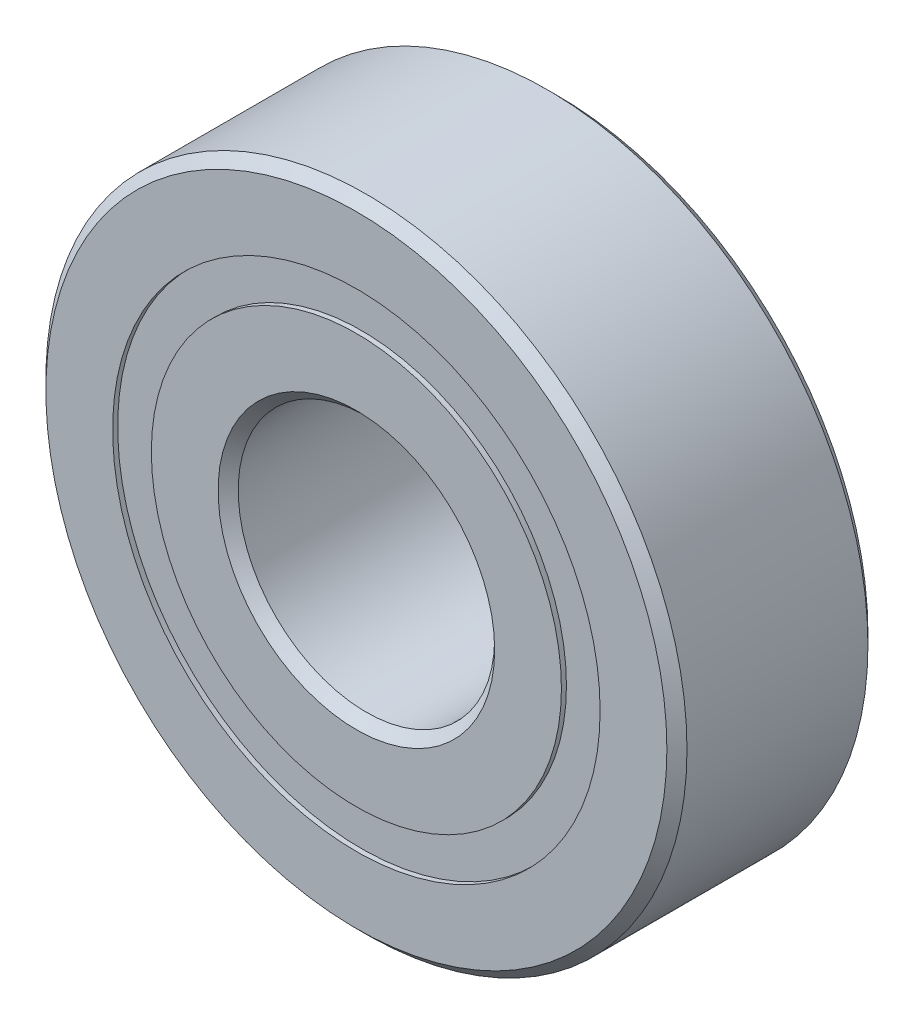
ISO-10303-21;
HEADER;
FILE_DESCRIPTION(('STEP AP214'),'2;1');
FILE_NAME('part.step','',(''),(''),'','','');
FILE_SCHEMA(('AUTOMOTIVE_DESIGN { 1 0 10303 214 1 1 1 1 }'));
ENDSEC;
DATA;
#1=APPLICATION_CONTEXT('core data for automotive mechanical design processes');
#2=APPLICATION_PROTOCOL_DEFINITION('international standard','automotive_design',2000,#1);
#3=PRODUCT_CONTEXT('',#1,'mechanical');
#4=PRODUCT('Part','Part','',(#3));
#5=PRODUCT_RELATED_PRODUCT_CATEGORY('part','',(#4));
#6=PRODUCT_DEFINITION_FORMATION('','',#4);
#7=PRODUCT_DEFINITION_CONTEXT('part definition',#1,'design');
#8=PRODUCT_DEFINITION('design','',#6,#7);
#9=PRODUCT_DEFINITION_SHAPE('','',#8);
#10=(LENGTH_UNIT() NAMED_UNIT(*) SI_UNIT(.MILLI.,.METRE.));
#11=(NAMED_UNIT(*) PLANE_ANGLE_UNIT() SI_UNIT($,.RADIAN.));
#12=(NAMED_UNIT(*) SI_UNIT($,.STERADIAN.) SOLID_ANGLE_UNIT());
#13=UNCERTAINTY_MEASURE_WITH_UNIT(LENGTH_MEASURE(1.E-05),#10,'distance_accuracy_value','');
#14=(GEOMETRIC_REPRESENTATION_CONTEXT(3) GLOBAL_UNCERTAINTY_ASSIGNED_CONTEXT((#13)) GLOBAL_UNIT_ASSIGNED_CONTEXT((#10,
#11,#12)) REPRESENTATION_CONTEXT('',''));
#15=CARTESIAN_POINT('',(0.,0.,0.));
#16=DIRECTION('',(0.,0.,1.));
#17=DIRECTION('',(1.,0.,0.));
#18=AXIS2_PLACEMENT_3D('',#15,#16,#17);
#19=CARTESIAN_POINT('',(0.,6.03522142857143,-2.36474000000001));
#20=DIRECTION('',(0.,0.,1.));
#21=DIRECTION('',(1.,0.,0.));
#22=AXIS2_PLACEMENT_3D('',#19,#20,#21);
#23=PLANE('',#22);
#24=CARTESIAN_POINT('',(0.,0.,-2.36474000000001));
#25=DIRECTION('',(0.,0.,1.));
#26=DIRECTION('',(1.,0.,0.));
#27=AXIS2_PLACEMENT_3D('',#24,#25,#26);
#28=CIRCLE('',#27,6.03522142857143);
#29=CARTESIAN_POINT('',(6.03522142857143,0.,-2.36474000000001));
#30=VERTEX_POINT('',#29);
#31=EDGE_CURVE('E58',#30,#30,#28,.T.);
#32=ORIENTED_EDGE('',*,*,#31,.F.);
#33=EDGE_LOOP('',(#32));
#34=FACE_BOUND('',#33,.T.);
#35=CARTESIAN_POINT('',(0.,0.,-2.36474000000001));
#36=DIRECTION('',(0.,0.,1.));
#37=DIRECTION('',(1.,0.,0.));
#38=AXIS2_PLACEMENT_3D('',#35,#36,#37);
#39=CIRCLE('',#38,5.07727857142857);
#40=CARTESIAN_POINT('',(5.07727857142857,0.,-2.36474000000001));
#41=VERTEX_POINT('',#40);
#42=EDGE_CURVE('E11',#41,#41,#39,.T.);
#43=ORIENTED_EDGE('',*,*,#42,.T.);
#44=EDGE_LOOP('',(#43));
#45=FACE_BOUND('',#44,.T.);
#46=ADVANCED_FACE('F44',(#34,#45),#23,.F.);
#47=CARTESIAN_POINT('',(0.,0.,2.4892));
#48=DIRECTION('',(0.,0.,1.));
#49=DIRECTION('',(1.,0.,0.));
#50=AXIS2_PLACEMENT_3D('',#47,#48,#49);
#51=CYLINDRICAL_SURFACE('',#50,5.07727857142857);
#52=ORIENTED_EDGE('',*,*,#42,.F.);
#53=EDGE_LOOP('',(#52));
#54=FACE_BOUND('',#53,.T.);
#55=CARTESIAN_POINT('',(0.,0.,-1.20554465033679));
#56=DIRECTION('',(0.,0.,1.));
#57=DIRECTION('',(1.,0.,0.));
#58=AXIS2_PLACEMENT_3D('',#55,#56,#57);
#59=CIRCLE('',#58,5.07727857142857);
#60=CARTESIAN_POINT('',(5.07727857142857,0.,-1.20554465033679));
#61=VERTEX_POINT('',#60);
#62=EDGE_CURVE('E50',#61,#61,#59,.T.);
#63=ORIENTED_EDGE('',*,*,#62,.T.);
#64=EDGE_LOOP('',(#63));
#65=FACE_BOUND('',#64,.T.);
#66=ADVANCED_FACE('F67',(#54,#65),#51,.F.);
#67=CARTESIAN_POINT('',(0.,6.03522142857143,-1.20554465033679));
#68=DIRECTION('',(0.,0.,-1.));
#69=DIRECTION('',(-1.,0.,0.));
#70=AXIS2_PLACEMENT_3D('',#67,#68,#69);
#71=PLANE('',#70);
#72=ORIENTED_EDGE('',*,*,#62,.F.);
#73=EDGE_LOOP('',(#72));
#74=FACE_BOUND('',#73,.T.);
#75=CARTESIAN_POINT('',(0.,0.,-1.20554465033679));
#76=DIRECTION('',(0.,0.,1.));
#77=DIRECTION('',(1.,0.,0.));
#78=AXIS2_PLACEMENT_3D('',#75,#76,#77);
#79=CIRCLE('',#78,6.03522142857143);
#80=CARTESIAN_POINT('',(6.03522142857143,0.,-1.20554465033679));
#81=VERTEX_POINT('',#80);
#82=EDGE_CURVE('E54',#81,#81,#79,.T.);
#83=ORIENTED_EDGE('',*,*,#82,.T.);
#84=EDGE_LOOP('',(#83));
#85=FACE_BOUND('',#84,.T.);
#86=ADVANCED_FACE('F71',(#74,#85),#71,.F.);
#87=CARTESIAN_POINT('',(0.,0.,2.4892));
#88=DIRECTION('',(0.,0.,1.));
#89=DIRECTION('',(1.,0.,0.));
#90=AXIS2_PLACEMENT_3D('',#87,#88,#89);
#91=CYLINDRICAL_SURFACE('',#90,6.03522142857143);
#92=ORIENTED_EDGE('',*,*,#82,.F.);
#93=EDGE_LOOP('',(#92));
#94=FACE_BOUND('',#93,.T.);
#95=ORIENTED_EDGE('',*,*,#31,.T.);
#96=EDGE_LOOP('',(#95));
#97=FACE_BOUND('',#96,.T.);
#98=ADVANCED_FACE('F64',(#94,#97),#91,.T.);
#99=CLOSED_SHELL('',(#46,#66,#86,#98));
#100=MANIFOLD_SOLID_BREP('B2',#99);
#101=CARTESIAN_POINT('',(0.,6.03522142857143,2.36474));
#102=DIRECTION('',(0.,0.,-1.));
#103=DIRECTION('',(-1.,0.,0.));
#104=AXIS2_PLACEMENT_3D('',#101,#102,#103);
#105=PLANE('',#104);
#106=CARTESIAN_POINT('',(0.,0.,2.36474));
#107=DIRECTION('',(0.,0.,1.));
#108=DIRECTION('',(1.,0.,0.));
#109=AXIS2_PLACEMENT_3D('',#106,#107,#108);
#110=CIRCLE('',#109,5.07727857142857);
#111=CARTESIAN_POINT('',(5.07727857142857,0.,2.36474));
#112=VERTEX_POINT('',#111);
#113=EDGE_CURVE('E43',#112,#112,#110,.T.);
#114=ORIENTED_EDGE('',*,*,#113,.F.);
#115=EDGE_LOOP('',(#114));
#116=FACE_BOUND('',#115,.T.);
#117=CARTESIAN_POINT('',(0.,0.,2.36474));
#118=DIRECTION('',(0.,0.,1.));
#119=DIRECTION('',(1.,0.,0.));
#120=AXIS2_PLACEMENT_3D('',#117,#118,#119);
#121=CIRCLE('',#120,6.03522142857143);
#122=CARTESIAN_POINT('',(6.03522142857143,0.,2.36474));
#123=VERTEX_POINT('',#122);
#124=EDGE_CURVE('E126',#123,#123,#121,.T.);
#125=ORIENTED_EDGE('',*,*,#124,.T.);
#126=EDGE_LOOP('',(#125));
#127=FACE_BOUND('',#126,.T.);
#128=ADVANCED_FACE('F112',(#116,#127),#105,.F.);
#129=CARTESIAN_POINT('',(0.,0.,2.4892));
#130=DIRECTION('',(0.,0.,1.));
#131=DIRECTION('',(1.,0.,0.));
#132=AXIS2_PLACEMENT_3D('',#129,#130,#131);
#133=CYLINDRICAL_SURFACE('',#132,5.07727857142857);
#134=CARTESIAN_POINT('',(0.,0.,1.20554465033679));
#135=DIRECTION('',(0.,0.,1.));
#136=DIRECTION('',(1.,0.,0.));
#137=AXIS2_PLACEMENT_3D('',#134,#135,#136);
#138=CIRCLE('',#137,5.07727857142857);
#139=CARTESIAN_POINT('',(5.07727857142857,0.,1.20554465033679));
#140=VERTEX_POINT('',#139);
#141=EDGE_CURVE('E118',#140,#140,#138,.T.);
#142=ORIENTED_EDGE('',*,*,#141,.F.);
#143=EDGE_LOOP('',(#142));
#144=FACE_BOUND('',#143,.T.);
#145=ORIENTED_EDGE('',*,*,#113,.T.);
#146=EDGE_LOOP('',(#145));
#147=FACE_BOUND('',#146,.T.);
#148=ADVANCED_FACE('F141',(#144,#147),#133,.F.);
#149=CARTESIAN_POINT('',(0.,6.03522142857143,1.20554465033679));
#150=DIRECTION('',(0.,0.,1.));
#151=DIRECTION('',(1.,0.,0.));
#152=AXIS2_PLACEMENT_3D('',#149,#150,#151);
#153=PLANE('',#152);
#154=CARTESIAN_POINT('',(0.,0.,1.20554465033679));
#155=DIRECTION('',(0.,0.,1.));
#156=DIRECTION('',(1.,0.,0.));
#157=AXIS2_PLACEMENT_3D('',#154,#155,#156);
#158=CIRCLE('',#157,6.03522142857143);
#159=CARTESIAN_POINT('',(6.03522142857143,0.,1.20554465033679));
#160=VERTEX_POINT('',#159);
#161=EDGE_CURVE('E122',#160,#160,#158,.T.);
#162=ORIENTED_EDGE('',*,*,#161,.F.);
#163=EDGE_LOOP('',(#162));
#164=FACE_BOUND('',#163,.T.);
#165=ORIENTED_EDGE('',*,*,#141,.T.);
#166=EDGE_LOOP('',(#165));
#167=FACE_BOUND('',#166,.T.);
#168=ADVANCED_FACE('F136',(#164,#167),#153,.F.);
#169=CARTESIAN_POINT('',(0.,0.,2.4892));
#170=DIRECTION('',(0.,0.,1.));
#171=DIRECTION('',(1.,0.,0.));
#172=AXIS2_PLACEMENT_3D('',#169,#170,#171);
#173=CYLINDRICAL_SURFACE('',#172,6.03522142857143);
#174=ORIENTED_EDGE('',*,*,#124,.F.);
#175=EDGE_LOOP('',(#174));
#176=FACE_BOUND('',#175,.T.);
#177=ORIENTED_EDGE('',*,*,#161,.T.);
#178=EDGE_LOOP('',(#177));
#179=FACE_BOUND('',#178,.T.);
#180=ADVANCED_FACE('F133',(#176,#179),#173,.T.);
#181=CLOSED_SHELL('',(#128,#148,#168,#180));
#182=MANIFOLD_SOLID_BREP('B6',#181);
#183=CARTESIAN_POINT('',(-3.26588180804999,4.49510067499584,0.));
#184=DIRECTION('',(0.,0.,1.));
#185=DIRECTION('',(-0.587785252292462,0.809016994374955,0.));
#186=AXIS2_PLACEMENT_3D('',#183,#184,#185);
#187=SPHERICAL_SURFACE('',#186,1.20554465033679);
#188=CARTESIAN_POINT('',(-3.26588180804999,4.49510067499584,1.20554465033679));
#189=VERTEX_POINT('',#188);
#190=VERTEX_LOOP('',#189);
#191=FACE_BOUND('',#190,.T.);
#192=ADVANCED_FACE('F180',(#191),#187,.T.);
#193=CLOSED_SHELL('',(#192));
#194=MANIFOLD_SOLID_BREP('B38',#193);
#195=CARTESIAN_POINT('',(-5.28430776866493,1.71697567499586,0.));
#196=DIRECTION('',(0.,0.,1.));
#197=DIRECTION('',(-0.95105651629515,0.309016994374958,0.));
#198=AXIS2_PLACEMENT_3D('',#195,#196,#197);
#199=SPHERICAL_SURFACE('',#198,1.20554465033679);
#200=CARTESIAN_POINT('',(-5.28430776866493,1.71697567499586,1.20554465033679));
#201=VERTEX_POINT('',#200);
#202=VERTEX_LOOP('',#201);
#203=FACE_BOUND('',#202,.T.);
#204=ADVANCED_FACE('F201',(#203),#199,.T.);
#205=CLOSED_SHELL('',(#204));
#206=MANIFOLD_SOLID_BREP('B108',#205);
#207=CARTESIAN_POINT('',(-5.28430776866496,-1.71697567499575,0.));
#208=DIRECTION('',(0.,0.,1.));
#209=DIRECTION('',(-0.951056516295157,-0.309016994374938,0.));
#210=AXIS2_PLACEMENT_3D('',#207,#208,#209);
#211=SPHERICAL_SURFACE('',#210,1.20554465033679);
#212=CARTESIAN_POINT('',(-5.28430776866496,-1.71697567499575,1.20554465033679));
#213=VERTEX_POINT('',#212);
#214=VERTEX_LOOP('',#213);
#215=FACE_BOUND('',#214,.T.);
#216=ADVANCED_FACE('F222',(#215),#211,.T.);
#217=CLOSED_SHELL('',(#216));
#218=MANIFOLD_SOLID_BREP('B176',#217);
#219=CARTESIAN_POINT('',(-3.26588180805009,-4.49510067499577,0.));
#220=DIRECTION('',(0.,0.,1.));
#221=DIRECTION('',(-0.58778525229248,-0.809016994374942,0.));
#222=AXIS2_PLACEMENT_3D('',#219,#220,#221);
#223=SPHERICAL_SURFACE('',#222,1.20554465033679);
#224=CARTESIAN_POINT('',(-3.26588180805009,-4.49510067499577,1.20554465033679));
#225=VERTEX_POINT('',#224);
#226=VERTEX_LOOP('',#225);
#227=FACE_BOUND('',#226,.T.);
#228=ADVANCED_FACE('F243',(#227),#223,.T.);
#229=CLOSED_SHELL('',(#228));
#230=MANIFOLD_SOLID_BREP('B197',#229);
#231=CARTESIAN_POINT('',(0.,-5.55625,0.));
#232=DIRECTION('',(0.,0.,1.));
#233=DIRECTION('',(0.,-1.,0.));
#234=AXIS2_PLACEMENT_3D('',#231,#232,#233);
#235=SPHERICAL_SURFACE('',#234,1.20554465033679);
#236=CARTESIAN_POINT('',(0.,-5.55625,1.20554465033679));
#237=VERTEX_POINT('',#236);
#238=VERTEX_LOOP('',#237);
#239=FACE_BOUND('',#238,.T.);
#240=ADVANCED_FACE('F264',(#239),#235,.T.);
#241=CLOSED_SHELL('',(#240));
#242=MANIFOLD_SOLID_BREP('B218',#241);
#243=CARTESIAN_POINT('',(3.26588180805003,-4.49510067499582,0.));
#244=DIRECTION('',(0.,0.,1.));
#245=DIRECTION('',(0.587785252292469,-0.809016994374951,0.));
#246=AXIS2_PLACEMENT_3D('',#243,#244,#245);
#247=SPHERICAL_SURFACE('',#246,1.20554465033679);
#248=CARTESIAN_POINT('',(3.26588180805003,-4.49510067499582,1.20554465033679));
#249=VERTEX_POINT('',#248);
#250=VERTEX_LOOP('',#249);
#251=FACE_BOUND('',#250,.T.);
#252=ADVANCED_FACE('F285',(#251),#247,.T.);
#253=CLOSED_SHELL('',(#252));
#254=MANIFOLD_SOLID_BREP('B239',#253);
#255=CARTESIAN_POINT('',(5.28430776866494,-1.71697567499582,0.));
#256=DIRECTION('',(0.,0.,1.));
#257=DIRECTION('',(0.951056516295152,-0.309016994374952,0.));
#258=AXIS2_PLACEMENT_3D('',#255,#256,#257);
#259=SPHERICAL_SURFACE('',#258,1.20554465033679);
#260=CARTESIAN_POINT('',(5.28430776866494,-1.71697567499582,1.20554465033679));
#261=VERTEX_POINT('',#260);
#262=VERTEX_LOOP('',#261);
#263=FACE_BOUND('',#262,.T.);
#264=ADVANCED_FACE('F306',(#263),#259,.T.);
#265=CLOSED_SHELL('',(#264));
#266=MANIFOLD_SOLID_BREP('B260',#265);
#267=CARTESIAN_POINT('',(5.28430776866495,1.71697567499579,0.));
#268=DIRECTION('',(0.,0.,1.));
#269=DIRECTION('',(0.951056516295155,0.309016994374945,0.));
#270=AXIS2_PLACEMENT_3D('',#267,#268,#269);
#271=SPHERICAL_SURFACE('',#270,1.20554465033679);
#272=CARTESIAN_POINT('',(5.28430776866495,1.71697567499579,1.20554465033679));
#273=VERTEX_POINT('',#272);
#274=VERTEX_LOOP('',#273);
#275=FACE_BOUND('',#274,.T.);
#276=ADVANCED_FACE('F327',(#275),#271,.T.);
#277=CLOSED_SHELL('',(#276));
#278=MANIFOLD_SOLID_BREP('B281',#277);
#279=CARTESIAN_POINT('',(3.26588180805006,4.4951006749958,0.));
#280=DIRECTION('',(0.,0.,1.));
#281=DIRECTION('',(0.587785252292474,0.809016994374947,0.));
#282=AXIS2_PLACEMENT_3D('',#279,#280,#281);
#283=SPHERICAL_SURFACE('',#282,1.20554465033679);
#284=CARTESIAN_POINT('',(3.26588180805006,4.4951006749958,1.20554465033679));
#285=VERTEX_POINT('',#284);
#286=VERTEX_LOOP('',#285);
#287=FACE_BOUND('',#286,.T.);
#288=ADVANCED_FACE('F348',(#287),#283,.T.);
#289=CLOSED_SHELL('',(#288));
#290=MANIFOLD_SOLID_BREP('B302',#289);
#291=CARTESIAN_POINT('',(0.,5.55625,0.));
#292=DIRECTION('',(0.,0.,1.));
#293=DIRECTION('',(0.,1.,0.));
#294=AXIS2_PLACEMENT_3D('',#291,#292,#293);
#295=SPHERICAL_SURFACE('',#294,1.20554465033679);
#296=CARTESIAN_POINT('',(0.,5.55625,1.20554465033679));
#297=VERTEX_POINT('',#296);
#298=VERTEX_LOOP('',#297);
#299=FACE_BOUND('',#298,.T.);
#300=ADVANCED_FACE('F371',(#299),#295,.T.);
#301=CLOSED_SHELL('',(#300));
#302=MANIFOLD_SOLID_BREP('B323',#301);
#303=CARTESIAN_POINT('',(0.,5.07727857142857,2.4892));
#304=DIRECTION('',(0.,0.,-1.));
#305=DIRECTION('',(-1.,0.,0.));
#306=AXIS2_PLACEMENT_3D('',#303,#304,#305);
#307=PLANE('',#306);
#308=CARTESIAN_POINT('',(0.,0.,2.4892));
#309=DIRECTION('',(0.,0.,1.));
#310=DIRECTION('',(1.,0.,0.));
#311=AXIS2_PLACEMENT_3D('',#308,#309,#310);
#312=CIRCLE('',#311,3.42392);
#313=CARTESIAN_POINT('',(3.42392,0.,2.4892));
#314=VERTEX_POINT('',#313);
#315=EDGE_CURVE('E419',#314,#314,#312,.T.);
#316=ORIENTED_EDGE('',*,*,#315,.F.);
#317=EDGE_LOOP('',(#316));
#318=FACE_BOUND('',#317,.T.);
#319=CARTESIAN_POINT('',(0.,0.,2.4892));
#320=DIRECTION('',(0.,0.,1.));
#321=DIRECTION('',(1.,0.,0.));
#322=AXIS2_PLACEMENT_3D('',#319,#320,#321);
#323=CIRCLE('',#322,5.07727857142857);
#324=CARTESIAN_POINT('',(5.07727857142857,0.,2.4892));
#325=VERTEX_POINT('',#324);
#326=EDGE_CURVE('E370',#325,#325,#323,.T.);
#327=ORIENTED_EDGE('',*,*,#326,.T.);
#328=EDGE_LOOP('',(#327));
#329=FACE_BOUND('',#328,.T.);
#330=ADVANCED_FACE('F391',(#318,#329),#307,.F.);
#331=CARTESIAN_POINT('',(0.,0.,2.4892));
#332=DIRECTION('',(0.,0.,1.));
#333=DIRECTION('',(1.,0.,0.));
#334=AXIS2_PLACEMENT_3D('',#331,#332,#333);
#335=CYLINDRICAL_SURFACE('',#334,5.07727857142857);
#336=ORIENTED_EDGE('',*,*,#326,.F.);
#337=EDGE_LOOP('',(#336));
#338=FACE_BOUND('',#337,.T.);
#339=CARTESIAN_POINT('',(0.,0.,1.10631111111111));
#340=DIRECTION('',(0.,0.,1.));
#341=DIRECTION('',(1.,0.,0.));
#342=AXIS2_PLACEMENT_3D('',#339,#340,#341);
#343=CIRCLE('',#342,5.07727857142857);
#344=CARTESIAN_POINT('',(5.07727857142857,0.,1.10631111111111));
#345=VERTEX_POINT('',#344);
#346=EDGE_CURVE('E397',#345,#345,#343,.T.);
#347=ORIENTED_EDGE('',*,*,#346,.T.);
#348=EDGE_LOOP('',(#347));
#349=FACE_BOUND('',#348,.T.);
#350=ADVANCED_FACE('F426',(#338,#349),#335,.T.);
#351=CARTESIAN_POINT('',(0.,0.,0.));
#352=DIRECTION('',(0.,0.,1.));
#353=DIRECTION('',(1.,0.,0.));
#354=AXIS2_PLACEMENT_3D('',#351,#352,#353);
#355=TOROIDAL_SURFACE('',#354,5.55625,1.20554465033679);
#356=ORIENTED_EDGE('',*,*,#346,.F.);
#357=EDGE_LOOP('',(#356));
#358=FACE_BOUND('',#357,.T.);
#359=CARTESIAN_POINT('',(0.,0.,-1.10631111111111));
#360=DIRECTION('',(0.,0.,1.));
#361=DIRECTION('',(1.,0.,0.));
#362=AXIS2_PLACEMENT_3D('',#359,#360,#361);
#363=CIRCLE('',#362,5.07727857142857);
#364=CARTESIAN_POINT('',(5.07727857142857,0.,-1.10631111111111));
#365=VERTEX_POINT('',#364);
#366=EDGE_CURVE('E401',#365,#365,#363,.T.);
#367=ORIENTED_EDGE('',*,*,#366,.T.);
#368=EDGE_LOOP('',(#367));
#369=FACE_BOUND('',#368,.T.);
#370=ADVANCED_FACE('F430',(#358,#369),#355,.F.);
#371=CARTESIAN_POINT('',(0.,0.,2.4892));
#372=DIRECTION('',(0.,0.,1.));
#373=DIRECTION('',(1.,0.,0.));
#374=AXIS2_PLACEMENT_3D('',#371,#372,#373);
#375=CYLINDRICAL_SURFACE('',#374,5.07727857142857);
#376=ORIENTED_EDGE('',*,*,#366,.F.);
#377=EDGE_LOOP('',(#376));
#378=FACE_BOUND('',#377,.T.);
#379=CARTESIAN_POINT('',(0.,0.,-2.4892));
#380=DIRECTION('',(0.,0.,1.));
#381=DIRECTION('',(1.,0.,0.));
#382=AXIS2_PLACEMENT_3D('',#379,#380,#381);
#383=CIRCLE('',#382,5.07727857142857);
#384=CARTESIAN_POINT('',(5.07727857142857,0.,-2.4892));
#385=VERTEX_POINT('',#384);
#386=EDGE_CURVE('E405',#385,#385,#383,.T.);
#387=ORIENTED_EDGE('',*,*,#386,.T.);
#388=EDGE_LOOP('',(#387));
#389=FACE_BOUND('',#388,.T.);
#390=ADVANCED_FACE('F435',(#378,#389),#375,.T.);
#391=CARTESIAN_POINT('',(0.,3.42392,-2.4892));
#392=DIRECTION('',(0.,0.,1.));
#393=DIRECTION('',(1.,0.,0.));
#394=AXIS2_PLACEMENT_3D('',#391,#392,#393);
#395=PLANE('',#394);
#396=ORIENTED_EDGE('',*,*,#386,.F.);
#397=EDGE_LOOP('',(#396));
#398=FACE_BOUND('',#397,.T.);
#399=CARTESIAN_POINT('',(0.,0.,-2.4892));
#400=DIRECTION('',(0.,0.,1.));
#401=DIRECTION('',(1.,0.,0.));
#402=AXIS2_PLACEMENT_3D('',#399,#400,#401);
#403=CIRCLE('',#402,3.42392);
#404=CARTESIAN_POINT('',(3.42392,0.,-2.4892));
#405=VERTEX_POINT('',#404);
#406=EDGE_CURVE('E410',#405,#405,#403,.T.);
#407=ORIENTED_EDGE('',*,*,#406,.T.);
#408=EDGE_LOOP('',(#407));
#409=FACE_BOUND('',#408,.T.);
#410=ADVANCED_FACE('F441',(#398,#409),#395,.F.);
#411=CARTESIAN_POINT('',(0.,0.,-2.24028));
#412=DIRECTION('',(0.,0.,-1.));
#413=DIRECTION('',(-1.,0.,0.));
#414=AXIS2_PLACEMENT_3D('',#411,#412,#413);
#415=CONICAL_SURFACE('',#414,3.175,0.785398163397443);
#416=ORIENTED_EDGE('',*,*,#406,.F.);
#417=EDGE_LOOP('',(#416));
#418=FACE_BOUND('',#417,.T.);
#419=CARTESIAN_POINT('',(0.,0.,-2.24028));
#420=DIRECTION('',(0.,0.,1.));
#421=DIRECTION('',(1.,0.,0.));
#422=AXIS2_PLACEMENT_3D('',#419,#420,#421);
#423=CIRCLE('',#422,3.175);
#424=CARTESIAN_POINT('',(3.175,0.,-2.24028));
#425=VERTEX_POINT('',#424);
#426=EDGE_CURVE('E413',#425,#425,#423,.T.);
#427=ORIENTED_EDGE('',*,*,#426,.T.);
#428=EDGE_LOOP('',(#427));
#429=FACE_BOUND('',#428,.T.);
#430=ADVANCED_FACE('F445',(#418,#429),#415,.F.);
#431=CARTESIAN_POINT('',(0.,0.,2.4892));
#432=DIRECTION('',(0.,0.,1.));
#433=DIRECTION('',(1.,0.,0.));
#434=AXIS2_PLACEMENT_3D('',#431,#432,#433);
#435=CYLINDRICAL_SURFACE('',#434,3.175);
#436=ORIENTED_EDGE('',*,*,#426,.F.);
#437=EDGE_LOOP('',(#436));
#438=FACE_BOUND('',#437,.T.);
#439=CARTESIAN_POINT('',(0.,0.,2.24028));
#440=DIRECTION('',(0.,0.,1.));
#441=DIRECTION('',(1.,0.,0.));
#442=AXIS2_PLACEMENT_3D('',#439,#440,#441);
#443=CIRCLE('',#442,3.175);
#444=CARTESIAN_POINT('',(3.175,0.,2.24028));
#445=VERTEX_POINT('',#444);
#446=EDGE_CURVE('E416',#445,#445,#443,.T.);
#447=ORIENTED_EDGE('',*,*,#446,.T.);
#448=EDGE_LOOP('',(#447));
#449=FACE_BOUND('',#448,.T.);
#450=ADVANCED_FACE('F449',(#438,#449),#435,.F.);
#451=CARTESIAN_POINT('',(0.,0.,2.4892));
#452=DIRECTION('',(0.,0.,1.));
#453=DIRECTION('',(1.,0.,0.));
#454=AXIS2_PLACEMENT_3D('',#451,#452,#453);
#455=CONICAL_SURFACE('',#454,3.42392,0.785398163397454);
#456=ORIENTED_EDGE('',*,*,#446,.F.);
#457=EDGE_LOOP('',(#456));
#458=FACE_BOUND('',#457,.T.);
#459=ORIENTED_EDGE('',*,*,#315,.T.);
#460=EDGE_LOOP('',(#459));
#461=FACE_BOUND('',#460,.T.);
#462=ADVANCED_FACE('F423',(#458,#461),#455,.F.);
#463=CLOSED_SHELL('',(#330,#350,#370,#390,#410,#430,#450,#462));
#464=MANIFOLD_SOLID_BREP('B344',#463);
#465=CARTESIAN_POINT('',(0.,0.,2.24028));
#466=DIRECTION('',(0.,0.,-1.));
#467=DIRECTION('',(-1.,0.,0.));
#468=AXIS2_PLACEMENT_3D('',#465,#466,#467);
#469=CONICAL_SURFACE('',#468,7.9375,0.785398163397444);
#470=CARTESIAN_POINT('',(0.,0.,2.4892));
#471=DIRECTION('',(0.,0.,1.));
#472=DIRECTION('',(1.,0.,0.));
#473=AXIS2_PLACEMENT_3D('',#470,#471,#472);
#474=CIRCLE('',#473,7.68858);
#475=CARTESIAN_POINT('',(7.68858,0.,2.4892));
#476=VERTEX_POINT('',#475);
#477=EDGE_CURVE('E541',#476,#476,#474,.T.);
#478=ORIENTED_EDGE('',*,*,#477,.F.);
#479=EDGE_LOOP('',(#478));
#480=FACE_BOUND('',#479,.T.);
#481=CARTESIAN_POINT('',(0.,0.,2.24028));
#482=DIRECTION('',(0.,0.,1.));
#483=DIRECTION('',(1.,0.,0.));
#484=AXIS2_PLACEMENT_3D('',#481,#482,#483);
#485=CIRCLE('',#484,7.9375);
#486=CARTESIAN_POINT('',(7.9375,0.,2.24028));
#487=VERTEX_POINT('',#486);
#488=EDGE_CURVE('E390',#487,#487,#485,.T.);
#489=ORIENTED_EDGE('',*,*,#488,.T.);
#490=EDGE_LOOP('',(#489));
#491=FACE_BOUND('',#490,.T.);
#492=ADVANCED_FACE('F513',(#480,#491),#469,.T.);
#493=CARTESIAN_POINT('',(0.,0.,2.4892));
#494=DIRECTION('',(0.,0.,1.));
#495=DIRECTION('',(1.,0.,0.));
#496=AXIS2_PLACEMENT_3D('',#493,#494,#495);
#497=CYLINDRICAL_SURFACE('',#496,7.9375);
#498=ORIENTED_EDGE('',*,*,#488,.F.);
#499=EDGE_LOOP('',(#498));
#500=FACE_BOUND('',#499,.T.);
#501=CARTESIAN_POINT('',(0.,0.,-2.24028));
#502=DIRECTION('',(0.,0.,1.));
#503=DIRECTION('',(1.,0.,0.));
#504=AXIS2_PLACEMENT_3D('',#501,#502,#503);
#505=CIRCLE('',#504,7.9375);
#506=CARTESIAN_POINT('',(7.9375,0.,-2.24028));
#507=VERTEX_POINT('',#506);
#508=EDGE_CURVE('E519',#507,#507,#505,.T.);
#509=ORIENTED_EDGE('',*,*,#508,.T.);
#510=EDGE_LOOP('',(#509));
#511=FACE_BOUND('',#510,.T.);
#512=ADVANCED_FACE('F548',(#500,#511),#497,.T.);
#513=CARTESIAN_POINT('',(0.,0.,-2.4892));
#514=DIRECTION('',(0.,0.,1.));
#515=DIRECTION('',(1.,0.,0.));
#516=AXIS2_PLACEMENT_3D('',#513,#514,#515);
#517=CONICAL_SURFACE('',#516,7.68858,0.785398163397443);
#518=ORIENTED_EDGE('',*,*,#508,.F.);
#519=EDGE_LOOP('',(#518));
#520=FACE_BOUND('',#519,.T.);
#521=CARTESIAN_POINT('',(0.,0.,-2.4892));
#522=DIRECTION('',(0.,0.,1.));
#523=DIRECTION('',(1.,0.,0.));
#524=AXIS2_PLACEMENT_3D('',#521,#522,#523);
#525=CIRCLE('',#524,7.68858);
#526=CARTESIAN_POINT('',(7.68858,0.,-2.4892));
#527=VERTEX_POINT('',#526);
#528=EDGE_CURVE('E523',#527,#527,#525,.T.);
#529=ORIENTED_EDGE('',*,*,#528,.T.);
#530=EDGE_LOOP('',(#529));
#531=FACE_BOUND('',#530,.T.);
#532=ADVANCED_FACE('F552',(#520,#531),#517,.T.);
#533=CARTESIAN_POINT('',(0.,7.68858,-2.4892));
#534=DIRECTION('',(0.,0.,1.));
#535=DIRECTION('',(1.,0.,0.));
#536=AXIS2_PLACEMENT_3D('',#533,#534,#535);
#537=PLANE('',#536);
#538=ORIENTED_EDGE('',*,*,#528,.F.);
#539=EDGE_LOOP('',(#538));
#540=FACE_BOUND('',#539,.T.);
#541=CARTESIAN_POINT('',(0.,0.,-2.4892));
#542=DIRECTION('',(0.,0.,1.));
#543=DIRECTION('',(1.,0.,0.));
#544=AXIS2_PLACEMENT_3D('',#541,#542,#543);
#545=CIRCLE('',#544,6.03522142857143);
#546=CARTESIAN_POINT('',(6.03522142857143,0.,-2.4892));
#547=VERTEX_POINT('',#546);
#548=EDGE_CURVE('E527',#547,#547,#545,.T.);
#549=ORIENTED_EDGE('',*,*,#548,.T.);
#550=EDGE_LOOP('',(#549));
#551=FACE_BOUND('',#550,.T.);
#552=ADVANCED_FACE('F557',(#540,#551),#537,.F.);
#553=CARTESIAN_POINT('',(0.,0.,2.4892));
#554=DIRECTION('',(0.,0.,1.));
#555=DIRECTION('',(1.,0.,0.));
#556=AXIS2_PLACEMENT_3D('',#553,#554,#555);
#557=CYLINDRICAL_SURFACE('',#556,6.03522142857143);
#558=ORIENTED_EDGE('',*,*,#548,.F.);
#559=EDGE_LOOP('',(#558));
#560=FACE_BOUND('',#559,.T.);
#561=CARTESIAN_POINT('',(0.,0.,-1.10631111111111));
#562=DIRECTION('',(0.,0.,1.));
#563=DIRECTION('',(1.,0.,0.));
#564=AXIS2_PLACEMENT_3D('',#561,#562,#563);
#565=CIRCLE('',#564,6.03522142857143);
#566=CARTESIAN_POINT('',(6.03522142857143,0.,-1.10631111111111));
#567=VERTEX_POINT('',#566);
#568=EDGE_CURVE('E532',#567,#567,#565,.T.);
#569=ORIENTED_EDGE('',*,*,#568,.T.);
#570=EDGE_LOOP('',(#569));
#571=FACE_BOUND('',#570,.T.);
#572=ADVANCED_FACE('F563',(#560,#571),#557,.F.);
#573=CARTESIAN_POINT('',(0.,0.,0.));
#574=DIRECTION('',(0.,0.,1.));
#575=DIRECTION('',(1.,0.,0.));
#576=AXIS2_PLACEMENT_3D('',#573,#574,#575);
#577=TOROIDAL_SURFACE('',#576,5.55625,1.20554465033679);
#578=ORIENTED_EDGE('',*,*,#568,.F.);
#579=EDGE_LOOP('',(#578));
#580=FACE_BOUND('',#579,.T.);
#581=CARTESIAN_POINT('',(0.,0.,1.10631111111111));
#582=DIRECTION('',(0.,0.,1.));
#583=DIRECTION('',(1.,0.,0.));
#584=AXIS2_PLACEMENT_3D('',#581,#582,#583);
#585=CIRCLE('',#584,6.03522142857143);
#586=CARTESIAN_POINT('',(6.03522142857143,0.,1.10631111111111));
#587=VERTEX_POINT('',#586);
#588=EDGE_CURVE('E535',#587,#587,#585,.T.);
#589=ORIENTED_EDGE('',*,*,#588,.T.);
#590=EDGE_LOOP('',(#589));
#591=FACE_BOUND('',#590,.T.);
#592=ADVANCED_FACE('F567',(#580,#591),#577,.F.);
#593=CARTESIAN_POINT('',(0.,0.,2.4892));
#594=DIRECTION('',(0.,0.,1.));
#595=DIRECTION('',(1.,0.,0.));
#596=AXIS2_PLACEMENT_3D('',#593,#594,#595);
#597=CYLINDRICAL_SURFACE('',#596,6.03522142857143);
#598=ORIENTED_EDGE('',*,*,#588,.F.);
#599=EDGE_LOOP('',(#598));
#600=FACE_BOUND('',#599,.T.);
#601=CARTESIAN_POINT('',(0.,0.,2.4892));
#602=DIRECTION('',(0.,0.,1.));
#603=DIRECTION('',(1.,0.,0.));
#604=AXIS2_PLACEMENT_3D('',#601,#602,#603);
#605=CIRCLE('',#604,6.03522142857143);
#606=CARTESIAN_POINT('',(6.03522142857143,0.,2.4892));
#607=VERTEX_POINT('',#606);
#608=EDGE_CURVE('E538',#607,#607,#605,.T.);
#609=ORIENTED_EDGE('',*,*,#608,.T.);
#610=EDGE_LOOP('',(#609));
#611=FACE_BOUND('',#610,.T.);
#612=ADVANCED_FACE('F571',(#600,#611),#597,.F.);
#613=CARTESIAN_POINT('',(0.,7.68858,2.4892));
#614=DIRECTION('',(0.,0.,-1.));
#615=DIRECTION('',(-1.,0.,0.));
#616=AXIS2_PLACEMENT_3D('',#613,#614,#615);
#617=PLANE('',#616);
#618=ORIENTED_EDGE('',*,*,#608,.F.);
#619=EDGE_LOOP('',(#618));
#620=FACE_BOUND('',#619,.T.);
#621=ORIENTED_EDGE('',*,*,#477,.T.);
#622=EDGE_LOOP('',(#621));
#623=FACE_BOUND('',#622,.T.);
#624=ADVANCED_FACE('F545',(#620,#623),#617,.F.);
#625=CLOSED_SHELL('',(#492,#512,#532,#552,#572,#592,#612,#624));
#626=MANIFOLD_SOLID_BREP('B365',#625);
#627=ADVANCED_BREP_SHAPE_REPRESENTATION('',(#18,#100,#182,#194,#206,#218,#230,#242,#254,#266,
#278,#290,#302,#464,#626),#14);
#628=SHAPE_DEFINITION_REPRESENTATION(#9,#627);
ENDSEC;
END-ISO-10303-21;
